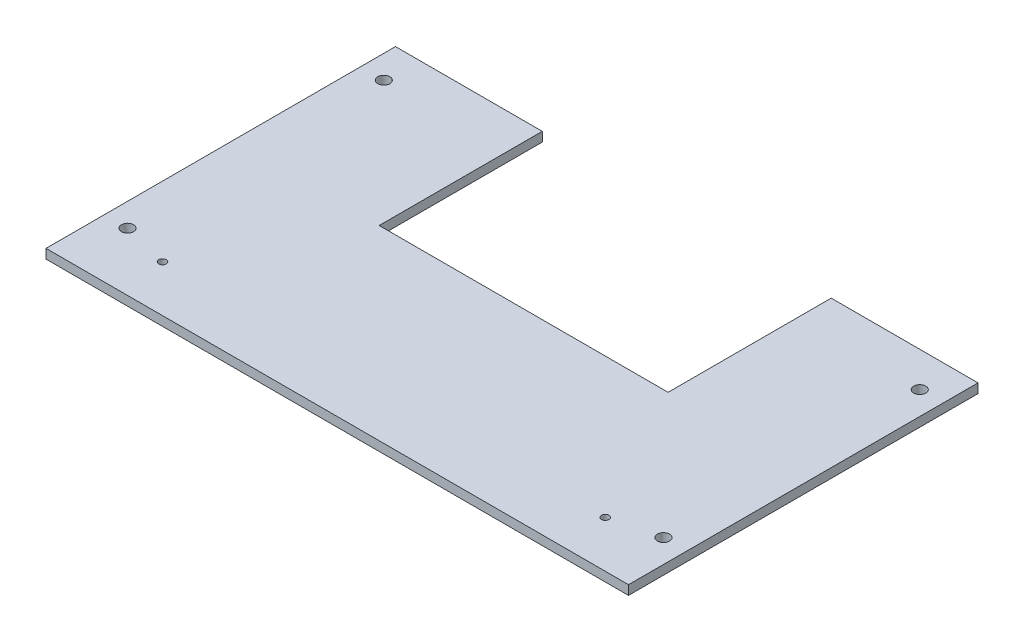
ISO-10303-21;
HEADER;
FILE_DESCRIPTION(('STEP AP214'),'2;1');
FILE_NAME('part.step','',(''),(''),'','','');
FILE_SCHEMA(('AUTOMOTIVE_DESIGN { 1 0 10303 214 1 1 1 1 }'));
ENDSEC;
DATA;
#1=APPLICATION_CONTEXT('core data for automotive mechanical design processes');
#2=APPLICATION_PROTOCOL_DEFINITION('international standard','automotive_design',2000,#1);
#3=PRODUCT_CONTEXT('',#1,'mechanical');
#4=PRODUCT('Part','Part','',(#3));
#5=PRODUCT_RELATED_PRODUCT_CATEGORY('part','',(#4));
#6=PRODUCT_DEFINITION_FORMATION('','',#4);
#7=PRODUCT_DEFINITION_CONTEXT('part definition',#1,'design');
#8=PRODUCT_DEFINITION('design','',#6,#7);
#9=PRODUCT_DEFINITION_SHAPE('','',#8);
#10=(LENGTH_UNIT() NAMED_UNIT(*) SI_UNIT(.MILLI.,.METRE.));
#11=(NAMED_UNIT(*) PLANE_ANGLE_UNIT() SI_UNIT($,.RADIAN.));
#12=(NAMED_UNIT(*) SI_UNIT($,.STERADIAN.) SOLID_ANGLE_UNIT());
#13=UNCERTAINTY_MEASURE_WITH_UNIT(LENGTH_MEASURE(1.E-05),#10,'distance_accuracy_value','');
#14=(GEOMETRIC_REPRESENTATION_CONTEXT(3) GLOBAL_UNCERTAINTY_ASSIGNED_CONTEXT((#13)) GLOBAL_UNIT_ASSIGNED_CONTEXT((#10,
#11,#12)) REPRESENTATION_CONTEXT('',''));
#15=CARTESIAN_POINT('',(0.,0.,0.));
#16=DIRECTION('',(0.,0.,1.));
#17=DIRECTION('',(1.,0.,0.));
#18=AXIS2_PLACEMENT_3D('',#15,#16,#17);
#19=CARTESIAN_POINT('',(-125.,4.,-75.));
#20=DIRECTION('',(0.,0.,1.));
#21=DIRECTION('',(1.,0.,0.));
#22=AXIS2_PLACEMENT_3D('',#19,#20,#21);
#23=PLANE('',#22);
#24=DIRECTION('',(-1.,0.,0.));
#25=VECTOR('',#24,1.);
#26=CARTESIAN_POINT('',(-125.,4.,-75.));
#27=LINE('',#26,#25);
#28=CARTESIAN_POINT('',(-62.,4.,-75.));
#29=VERTEX_POINT('',#28);
#30=CARTESIAN_POINT('',(-125.,4.,-75.));
#31=VERTEX_POINT('',#30);
#32=EDGE_CURVE('E174',#29,#31,#27,.T.);
#33=ORIENTED_EDGE('',*,*,#32,.F.);
#34=DIRECTION('',(0.,1.,0.));
#35=VECTOR('',#34,1.);
#36=CARTESIAN_POINT('',(-62.,0.,-75.));
#37=LINE('',#36,#35);
#38=CARTESIAN_POINT('',(-62.,0.,-75.));
#39=VERTEX_POINT('',#38);
#40=EDGE_CURVE('E162',#39,#29,#37,.T.);
#41=ORIENTED_EDGE('',*,*,#40,.F.);
#42=DIRECTION('',(-1.,0.,0.));
#43=VECTOR('',#42,1.);
#44=CARTESIAN_POINT('',(-125.,0.,-75.));
#45=LINE('',#44,#43);
#46=CARTESIAN_POINT('',(-125.,0.,-75.));
#47=VERTEX_POINT('',#46);
#48=EDGE_CURVE('E144',#39,#47,#45,.T.);
#49=ORIENTED_EDGE('',*,*,#48,.T.);
#50=DIRECTION('',(0.,-1.,0.));
#51=VECTOR('',#50,1.);
#52=CARTESIAN_POINT('',(-125.,4.,-75.));
#53=LINE('',#52,#51);
#54=EDGE_CURVE('E54',#31,#47,#53,.T.);
#55=ORIENTED_EDGE('',*,*,#54,.F.);
#56=EDGE_LOOP('',(#33,#41,#49,#55));
#57=FACE_BOUND('',#56,.T.);
#58=ADVANCED_FACE('F44',(#57),#23,.F.);
#59=CARTESIAN_POINT('',(125.,4.,75.));
#60=DIRECTION('',(-1.,0.,0.));
#61=DIRECTION('',(0.,0.,1.));
#62=AXIS2_PLACEMENT_3D('',#59,#60,#61);
#63=PLANE('',#62);
#64=DIRECTION('',(0.,0.,-1.));
#65=VECTOR('',#64,1.);
#66=CARTESIAN_POINT('',(125.,0.,75.));
#67=LINE('',#66,#65);
#68=CARTESIAN_POINT('',(125.,0.,75.));
#69=VERTEX_POINT('',#68);
#70=CARTESIAN_POINT('',(125.,0.,-75.));
#71=VERTEX_POINT('',#70);
#72=EDGE_CURVE('E165',#69,#71,#67,.T.);
#73=ORIENTED_EDGE('',*,*,#72,.T.);
#74=DIRECTION('',(0.,-1.,0.));
#75=VECTOR('',#74,1.);
#76=CARTESIAN_POINT('',(125.,4.,-75.));
#77=LINE('',#76,#75);
#78=CARTESIAN_POINT('',(125.,4.,-75.));
#79=VERTEX_POINT('',#78);
#80=EDGE_CURVE('E11',#79,#71,#77,.T.);
#81=ORIENTED_EDGE('',*,*,#80,.F.);
#82=DIRECTION('',(0.,0.,-1.));
#83=VECTOR('',#82,1.);
#84=CARTESIAN_POINT('',(125.,4.,75.));
#85=LINE('',#84,#83);
#86=CARTESIAN_POINT('',(125.,4.,75.));
#87=VERTEX_POINT('',#86);
#88=EDGE_CURVE('E171',#87,#79,#85,.T.);
#89=ORIENTED_EDGE('',*,*,#88,.F.);
#90=DIRECTION('',(0.,-1.,0.));
#91=VECTOR('',#90,1.);
#92=CARTESIAN_POINT('',(125.,4.,75.));
#93=LINE('',#92,#91);
#94=EDGE_CURVE('E182',#87,#69,#93,.T.);
#95=ORIENTED_EDGE('',*,*,#94,.T.);
#96=EDGE_LOOP('',(#73,#81,#89,#95));
#97=FACE_BOUND('',#96,.T.);
#98=ADVANCED_FACE('F46',(#97),#63,.F.);
#99=CARTESIAN_POINT('',(62.,0.,-75.));
#100=VERTEX_POINT('',#99);
#101=EDGE_CURVE('E186',#71,#100,#45,.T.);
#102=ORIENTED_EDGE('',*,*,#101,.T.);
#103=DIRECTION('',(0.,1.,0.));
#104=VECTOR('',#103,1.);
#105=CARTESIAN_POINT('',(62.,0.,-75.));
#106=LINE('',#105,#104);
#107=CARTESIAN_POINT('',(62.,4.,-75.));
#108=VERTEX_POINT('',#107);
#109=EDGE_CURVE('E166',#100,#108,#106,.T.);
#110=ORIENTED_EDGE('',*,*,#109,.T.);
#111=EDGE_CURVE('E99',#79,#108,#27,.T.);
#112=ORIENTED_EDGE('',*,*,#111,.F.);
#113=ORIENTED_EDGE('',*,*,#80,.T.);
#114=EDGE_LOOP('',(#102,#110,#112,#113));
#115=FACE_BOUND('',#114,.T.);
#116=ADVANCED_FACE('F271',(#115),#23,.F.);
#117=CARTESIAN_POINT('',(-125.,4.,75.));
#118=DIRECTION('',(1.,0.,0.));
#119=DIRECTION('',(0.,0.,-1.));
#120=AXIS2_PLACEMENT_3D('',#117,#118,#119);
#121=PLANE('',#120);
#122=DIRECTION('',(0.,0.,1.));
#123=VECTOR('',#122,1.);
#124=CARTESIAN_POINT('',(-125.,0.,75.));
#125=LINE('',#124,#123);
#126=CARTESIAN_POINT('',(-125.,0.,75.));
#127=VERTEX_POINT('',#126);
#128=EDGE_CURVE('E190',#47,#127,#125,.T.);
#129=ORIENTED_EDGE('',*,*,#128,.T.);
#130=DIRECTION('',(0.,-1.,0.));
#131=VECTOR('',#130,1.);
#132=CARTESIAN_POINT('',(-125.,4.,75.));
#133=LINE('',#132,#131);
#134=CARTESIAN_POINT('',(-125.,4.,75.));
#135=VERTEX_POINT('',#134);
#136=EDGE_CURVE('E197',#135,#127,#133,.T.);
#137=ORIENTED_EDGE('',*,*,#136,.F.);
#138=DIRECTION('',(0.,0.,1.));
#139=VECTOR('',#138,1.);
#140=CARTESIAN_POINT('',(-125.,4.,75.));
#141=LINE('',#140,#139);
#142=EDGE_CURVE('E177',#31,#135,#141,.T.);
#143=ORIENTED_EDGE('',*,*,#142,.F.);
#144=ORIENTED_EDGE('',*,*,#54,.T.);
#145=EDGE_LOOP('',(#129,#137,#143,#144));
#146=FACE_BOUND('',#145,.T.);
#147=ADVANCED_FACE('F280',(#146),#121,.F.);
#148=CARTESIAN_POINT('',(-125.,4.,75.));
#149=DIRECTION('',(0.,0.,-1.));
#150=DIRECTION('',(-1.,0.,0.));
#151=AXIS2_PLACEMENT_3D('',#148,#149,#150);
#152=PLANE('',#151);
#153=DIRECTION('',(1.,0.,0.));
#154=VECTOR('',#153,1.);
#155=CARTESIAN_POINT('',(-125.,0.,75.));
#156=LINE('',#155,#154);
#157=EDGE_CURVE('E92',#127,#69,#156,.T.);
#158=ORIENTED_EDGE('',*,*,#157,.T.);
#159=ORIENTED_EDGE('',*,*,#94,.F.);
#160=DIRECTION('',(1.,0.,0.));
#161=VECTOR('',#160,1.);
#162=CARTESIAN_POINT('',(-125.,4.,75.));
#163=LINE('',#162,#161);
#164=EDGE_CURVE('E71',#135,#87,#163,.T.);
#165=ORIENTED_EDGE('',*,*,#164,.F.);
#166=ORIENTED_EDGE('',*,*,#136,.T.);
#167=EDGE_LOOP('',(#158,#159,#165,#166));
#168=FACE_BOUND('',#167,.T.);
#169=ADVANCED_FACE('F285',(#168),#152,.F.);
#170=CARTESIAN_POINT('',(0.,4.,0.));
#171=DIRECTION('',(0.,-1.,0.));
#172=DIRECTION('',(0.,0.,-1.));
#173=AXIS2_PLACEMENT_3D('',#170,#171,#172);
#174=PLANE('',#173);
#175=CARTESIAN_POINT('',(95.,4.,55.));
#176=DIRECTION('',(0.,1.,0.));
#177=DIRECTION('',(0.,0.,1.));
#178=AXIS2_PLACEMENT_3D('',#175,#176,#177);
#179=CIRCLE('',#178,1.60000000000001);
#180=CARTESIAN_POINT('',(95.,4.,56.6));
#181=VERTEX_POINT('',#180);
#182=EDGE_CURVE('E205',#181,#181,#179,.T.);
#183=ORIENTED_EDGE('',*,*,#182,.F.);
#184=EDGE_LOOP('',(#183));
#185=FACE_BOUND('',#184,.T.);
#186=CARTESIAN_POINT('',(-95.,4.,55.0000000000013));
#187=DIRECTION('',(0.,1.,0.));
#188=DIRECTION('',(0.,0.,1.));
#189=AXIS2_PLACEMENT_3D('',#186,#187,#188);
#190=CIRCLE('',#189,1.60000000000001);
#191=CARTESIAN_POINT('',(-95.,4.,56.6000000000013));
#192=VERTEX_POINT('',#191);
#193=EDGE_CURVE('E212',#192,#192,#190,.T.);
#194=ORIENTED_EDGE('',*,*,#193,.F.);
#195=EDGE_LOOP('',(#194));
#196=FACE_BOUND('',#195,.T.);
#197=CARTESIAN_POINT('',(-114.999999999999,4.,50.));
#198=DIRECTION('',(0.,1.,0.));
#199=DIRECTION('',(0.,0.,1.));
#200=AXIS2_PLACEMENT_3D('',#197,#198,#199);
#201=CIRCLE('',#200,2.6);
#202=CARTESIAN_POINT('',(-114.999999999999,4.,52.6));
#203=VERTEX_POINT('',#202);
#204=EDGE_CURVE('E242',#203,#203,#201,.T.);
#205=ORIENTED_EDGE('',*,*,#204,.F.);
#206=EDGE_LOOP('',(#205));
#207=FACE_BOUND('',#206,.T.);
#208=CARTESIAN_POINT('',(115.000000000001,4.,50.));
#209=DIRECTION('',(0.,1.,0.));
#210=DIRECTION('',(0.,0.,1.));
#211=AXIS2_PLACEMENT_3D('',#208,#209,#210);
#212=CIRCLE('',#211,2.6);
#213=CARTESIAN_POINT('',(115.000000000001,4.,52.6));
#214=VERTEX_POINT('',#213);
#215=EDGE_CURVE('E235',#214,#214,#212,.T.);
#216=ORIENTED_EDGE('',*,*,#215,.F.);
#217=EDGE_LOOP('',(#216));
#218=FACE_BOUND('',#217,.T.);
#219=CARTESIAN_POINT('',(115.,4.,-60.));
#220=DIRECTION('',(0.,1.,0.));
#221=DIRECTION('',(0.,0.,1.));
#222=AXIS2_PLACEMENT_3D('',#219,#220,#221);
#223=CIRCLE('',#222,2.6);
#224=CARTESIAN_POINT('',(115.,4.,-57.4));
#225=VERTEX_POINT('',#224);
#226=EDGE_CURVE('E227',#225,#225,#223,.T.);
#227=ORIENTED_EDGE('',*,*,#226,.F.);
#228=EDGE_LOOP('',(#227));
#229=FACE_BOUND('',#228,.T.);
#230=CARTESIAN_POINT('',(-115.,4.,-60.));
#231=DIRECTION('',(0.,1.,0.));
#232=DIRECTION('',(0.,0.,1.));
#233=AXIS2_PLACEMENT_3D('',#230,#231,#232);
#234=CIRCLE('',#233,2.6);
#235=CARTESIAN_POINT('',(-115.,4.,-57.4));
#236=VERTEX_POINT('',#235);
#237=EDGE_CURVE('E159',#236,#236,#234,.T.);
#238=ORIENTED_EDGE('',*,*,#237,.F.);
#239=EDGE_LOOP('',(#238));
#240=FACE_BOUND('',#239,.T.);
#241=DIRECTION('',(1.,0.,0.));
#242=VECTOR('',#241,1.);
#243=CARTESIAN_POINT('',(-62.,4.,-4.99999999999999));
#244=LINE('',#243,#242);
#245=CARTESIAN_POINT('',(-62.,4.,-4.99999999999999));
#246=VERTEX_POINT('',#245);
#247=CARTESIAN_POINT('',(62.,4.,-4.99999999999999));
#248=VERTEX_POINT('',#247);
#249=EDGE_CURVE('E149',#246,#248,#244,.T.);
#250=ORIENTED_EDGE('',*,*,#249,.F.);
#251=DIRECTION('',(0.,0.,1.));
#252=VECTOR('',#251,1.);
#253=CARTESIAN_POINT('',(-62.,4.,-4.99999999999999));
#254=LINE('',#253,#252);
#255=EDGE_CURVE('E128',#29,#246,#254,.T.);
#256=ORIENTED_EDGE('',*,*,#255,.F.);
#257=ORIENTED_EDGE('',*,*,#32,.T.);
#258=ORIENTED_EDGE('',*,*,#142,.T.);
#259=ORIENTED_EDGE('',*,*,#164,.T.);
#260=ORIENTED_EDGE('',*,*,#88,.T.);
#261=ORIENTED_EDGE('',*,*,#111,.T.);
#262=DIRECTION('',(0.,0.,-1.));
#263=VECTOR('',#262,1.);
#264=CARTESIAN_POINT('',(62.,4.,-4.99999999999999));
#265=LINE('',#264,#263);
#266=EDGE_CURVE('E146',#248,#108,#265,.T.);
#267=ORIENTED_EDGE('',*,*,#266,.F.);
#268=EDGE_LOOP('',(#250,#256,#257,#258,#259,#260,#261,#267));
#269=FACE_BOUND('',#268,.T.);
#270=ADVANCED_FACE('F295',(#185,#196,#207,#218,#229,#240,#269),#174,.F.);
#271=CARTESIAN_POINT('',(0.,0.,0.));
#272=DIRECTION('',(0.,-1.,0.));
#273=DIRECTION('',(0.,0.,-1.));
#274=AXIS2_PLACEMENT_3D('',#271,#272,#273);
#275=PLANE('',#274);
#276=CARTESIAN_POINT('',(95.,0.,55.));
#277=DIRECTION('',(0.,-1.,0.));
#278=DIRECTION('',(0.,0.,-1.));
#279=AXIS2_PLACEMENT_3D('',#276,#277,#278);
#280=CIRCLE('',#279,1.60000000000001);
#281=CARTESIAN_POINT('',(95.,0.,53.4));
#282=VERTEX_POINT('',#281);
#283=EDGE_CURVE('E48',#282,#282,#280,.T.);
#284=ORIENTED_EDGE('',*,*,#283,.F.);
#285=EDGE_LOOP('',(#284));
#286=FACE_BOUND('',#285,.T.);
#287=CARTESIAN_POINT('',(-95.,0.,55.0000000000013));
#288=DIRECTION('',(0.,-1.,0.));
#289=DIRECTION('',(0.,0.,-1.));
#290=AXIS2_PLACEMENT_3D('',#287,#288,#289);
#291=CIRCLE('',#290,1.60000000000001);
#292=CARTESIAN_POINT('',(-95.,0.,53.4000000000013));
#293=VERTEX_POINT('',#292);
#294=EDGE_CURVE('E202',#293,#293,#291,.T.);
#295=ORIENTED_EDGE('',*,*,#294,.F.);
#296=EDGE_LOOP('',(#295));
#297=FACE_BOUND('',#296,.T.);
#298=CARTESIAN_POINT('',(-114.999999999999,0.,50.));
#299=DIRECTION('',(0.,1.,0.));
#300=DIRECTION('',(0.,0.,1.));
#301=AXIS2_PLACEMENT_3D('',#298,#299,#300);
#302=CIRCLE('',#301,2.6);
#303=CARTESIAN_POINT('',(-114.999999999999,0.,52.6));
#304=VERTEX_POINT('',#303);
#305=EDGE_CURVE('E152',#304,#304,#302,.T.);
#306=ORIENTED_EDGE('',*,*,#305,.T.);
#307=EDGE_LOOP('',(#306));
#308=FACE_BOUND('',#307,.T.);
#309=CARTESIAN_POINT('',(115.000000000001,0.,50.));
#310=DIRECTION('',(0.,1.,0.));
#311=DIRECTION('',(0.,0.,1.));
#312=AXIS2_PLACEMENT_3D('',#309,#310,#311);
#313=CIRCLE('',#312,2.6);
#314=CARTESIAN_POINT('',(115.000000000001,0.,52.6));
#315=VERTEX_POINT('',#314);
#316=EDGE_CURVE('E239',#315,#315,#313,.T.);
#317=ORIENTED_EDGE('',*,*,#316,.T.);
#318=EDGE_LOOP('',(#317));
#319=FACE_BOUND('',#318,.T.);
#320=CARTESIAN_POINT('',(115.,0.,-60.));
#321=DIRECTION('',(0.,1.,0.));
#322=DIRECTION('',(0.,0.,1.));
#323=AXIS2_PLACEMENT_3D('',#320,#321,#322);
#324=CIRCLE('',#323,2.6);
#325=CARTESIAN_POINT('',(115.,0.,-57.4));
#326=VERTEX_POINT('',#325);
#327=EDGE_CURVE('E231',#326,#326,#324,.T.);
#328=ORIENTED_EDGE('',*,*,#327,.T.);
#329=EDGE_LOOP('',(#328));
#330=FACE_BOUND('',#329,.T.);
#331=CARTESIAN_POINT('',(-115.,0.,-60.));
#332=DIRECTION('',(0.,1.,0.));
#333=DIRECTION('',(0.,0.,1.));
#334=AXIS2_PLACEMENT_3D('',#331,#332,#333);
#335=CIRCLE('',#334,2.6);
#336=CARTESIAN_POINT('',(-115.,0.,-57.4));
#337=VERTEX_POINT('',#336);
#338=EDGE_CURVE('E223',#337,#337,#335,.T.);
#339=ORIENTED_EDGE('',*,*,#338,.T.);
#340=EDGE_LOOP('',(#339));
#341=FACE_BOUND('',#340,.T.);
#342=DIRECTION('',(0.,0.,1.));
#343=VECTOR('',#342,1.);
#344=CARTESIAN_POINT('',(-62.,0.,-4.99999999999999));
#345=LINE('',#344,#343);
#346=CARTESIAN_POINT('',(-62.,0.,-4.99999999999999));
#347=VERTEX_POINT('',#346);
#348=EDGE_CURVE('E125',#39,#347,#345,.T.);
#349=ORIENTED_EDGE('',*,*,#348,.T.);
#350=DIRECTION('',(1.,0.,0.));
#351=VECTOR('',#350,1.);
#352=CARTESIAN_POINT('',(-62.,0.,-4.99999999999999));
#353=LINE('',#352,#351);
#354=CARTESIAN_POINT('',(62.,0.,-4.99999999999999));
#355=VERTEX_POINT('',#354);
#356=EDGE_CURVE('E136',#347,#355,#353,.T.);
#357=ORIENTED_EDGE('',*,*,#356,.T.);
#358=DIRECTION('',(0.,0.,-1.));
#359=VECTOR('',#358,1.);
#360=CARTESIAN_POINT('',(62.,0.,-4.99999999999999));
#361=LINE('',#360,#359);
#362=EDGE_CURVE('E62',#355,#100,#361,.T.);
#363=ORIENTED_EDGE('',*,*,#362,.T.);
#364=ORIENTED_EDGE('',*,*,#101,.F.);
#365=ORIENTED_EDGE('',*,*,#72,.F.);
#366=ORIENTED_EDGE('',*,*,#157,.F.);
#367=ORIENTED_EDGE('',*,*,#128,.F.);
#368=ORIENTED_EDGE('',*,*,#48,.F.);
#369=EDGE_LOOP('',(#349,#357,#363,#364,#365,#366,#367,#368));
#370=FACE_BOUND('',#369,.T.);
#371=ADVANCED_FACE('F142',(#286,#297,#308,#319,#330,#341,#370),#275,.T.);
#372=CARTESIAN_POINT('',(-62.,0.,-4.99999999999999));
#373=DIRECTION('',(-1.,0.,0.));
#374=DIRECTION('',(0.,0.,1.));
#375=AXIS2_PLACEMENT_3D('',#372,#373,#374);
#376=PLANE('',#375);
#377=ORIENTED_EDGE('',*,*,#255,.T.);
#378=DIRECTION('',(0.,1.,0.));
#379=VECTOR('',#378,1.);
#380=CARTESIAN_POINT('',(-62.,0.,-4.99999999999999));
#381=LINE('',#380,#379);
#382=EDGE_CURVE('E121',#347,#246,#381,.T.);
#383=ORIENTED_EDGE('',*,*,#382,.F.);
#384=ORIENTED_EDGE('',*,*,#348,.F.);
#385=ORIENTED_EDGE('',*,*,#40,.T.);
#386=EDGE_LOOP('',(#377,#383,#384,#385));
#387=FACE_BOUND('',#386,.T.);
#388=ADVANCED_FACE('F123',(#387),#376,.F.);
#389=CARTESIAN_POINT('',(62.,0.,-4.99999999999999));
#390=DIRECTION('',(1.,0.,0.));
#391=DIRECTION('',(0.,0.,-1.));
#392=AXIS2_PLACEMENT_3D('',#389,#390,#391);
#393=PLANE('',#392);
#394=ORIENTED_EDGE('',*,*,#266,.T.);
#395=ORIENTED_EDGE('',*,*,#109,.F.);
#396=ORIENTED_EDGE('',*,*,#362,.F.);
#397=DIRECTION('',(0.,1.,0.));
#398=VECTOR('',#397,1.);
#399=CARTESIAN_POINT('',(62.,0.,-4.99999999999999));
#400=LINE('',#399,#398);
#401=EDGE_CURVE('E133',#355,#248,#400,.T.);
#402=ORIENTED_EDGE('',*,*,#401,.T.);
#403=EDGE_LOOP('',(#394,#395,#396,#402));
#404=FACE_BOUND('',#403,.T.);
#405=ADVANCED_FACE('F297',(#404),#393,.F.);
#406=CARTESIAN_POINT('',(-62.,0.,-4.99999999999999));
#407=DIRECTION('',(0.,0.,1.));
#408=DIRECTION('',(1.,0.,0.));
#409=AXIS2_PLACEMENT_3D('',#406,#407,#408);
#410=PLANE('',#409);
#411=ORIENTED_EDGE('',*,*,#249,.T.);
#412=ORIENTED_EDGE('',*,*,#401,.F.);
#413=ORIENTED_EDGE('',*,*,#356,.F.);
#414=ORIENTED_EDGE('',*,*,#382,.T.);
#415=EDGE_LOOP('',(#411,#412,#413,#414));
#416=FACE_BOUND('',#415,.T.);
#417=ADVANCED_FACE('F137',(#416),#410,.F.);
#418=CARTESIAN_POINT('',(-115.,0.,-60.));
#419=DIRECTION('',(0.,1.,0.));
#420=DIRECTION('',(0.,0.,1.));
#421=AXIS2_PLACEMENT_3D('',#418,#419,#420);
#422=CYLINDRICAL_SURFACE('',#421,2.6);
#423=ORIENTED_EDGE('',*,*,#338,.F.);
#424=EDGE_LOOP('',(#423));
#425=FACE_BOUND('',#424,.T.);
#426=ORIENTED_EDGE('',*,*,#237,.T.);
#427=EDGE_LOOP('',(#426));
#428=FACE_BOUND('',#427,.T.);
#429=ADVANCED_FACE('F302',(#425,#428),#422,.F.);
#430=CARTESIAN_POINT('',(115.,0.,-60.));
#431=DIRECTION('',(0.,1.,0.));
#432=DIRECTION('',(0.,0.,1.));
#433=AXIS2_PLACEMENT_3D('',#430,#431,#432);
#434=CYLINDRICAL_SURFACE('',#433,2.6);
#435=ORIENTED_EDGE('',*,*,#327,.F.);
#436=EDGE_LOOP('',(#435));
#437=FACE_BOUND('',#436,.T.);
#438=ORIENTED_EDGE('',*,*,#226,.T.);
#439=EDGE_LOOP('',(#438));
#440=FACE_BOUND('',#439,.T.);
#441=ADVANCED_FACE('F265',(#437,#440),#434,.F.);
#442=CARTESIAN_POINT('',(115.000000000001,0.,50.));
#443=DIRECTION('',(0.,1.,0.));
#444=DIRECTION('',(0.,0.,1.));
#445=AXIS2_PLACEMENT_3D('',#442,#443,#444);
#446=CYLINDRICAL_SURFACE('',#445,2.6);
#447=ORIENTED_EDGE('',*,*,#316,.F.);
#448=EDGE_LOOP('',(#447));
#449=FACE_BOUND('',#448,.T.);
#450=ORIENTED_EDGE('',*,*,#215,.T.);
#451=EDGE_LOOP('',(#450));
#452=FACE_BOUND('',#451,.T.);
#453=ADVANCED_FACE('F256',(#449,#452),#446,.F.);
#454=CARTESIAN_POINT('',(-114.999999999999,0.,50.));
#455=DIRECTION('',(0.,1.,0.));
#456=DIRECTION('',(0.,0.,1.));
#457=AXIS2_PLACEMENT_3D('',#454,#455,#456);
#458=CYLINDRICAL_SURFACE('',#457,2.6);
#459=ORIENTED_EDGE('',*,*,#305,.F.);
#460=EDGE_LOOP('',(#459));
#461=FACE_BOUND('',#460,.T.);
#462=ORIENTED_EDGE('',*,*,#204,.T.);
#463=EDGE_LOOP('',(#462));
#464=FACE_BOUND('',#463,.T.);
#465=ADVANCED_FACE('F253',(#461,#464),#458,.F.);
#466=CARTESIAN_POINT('',(-95.,-6.,55.0000000000013));
#467=DIRECTION('',(0.,1.,0.));
#468=DIRECTION('',(0.,0.,1.));
#469=AXIS2_PLACEMENT_3D('',#466,#467,#468);
#470=CYLINDRICAL_SURFACE('',#469,1.60000000000001);
#471=ORIENTED_EDGE('',*,*,#294,.T.);
#472=EDGE_LOOP('',(#471));
#473=FACE_BOUND('',#472,.T.);
#474=ORIENTED_EDGE('',*,*,#193,.T.);
#475=EDGE_LOOP('',(#474));
#476=FACE_BOUND('',#475,.T.);
#477=ADVANCED_FACE('F255',(#473,#476),#470,.F.);
#478=CARTESIAN_POINT('',(95.,-6.,55.));
#479=DIRECTION('',(0.,1.,0.));
#480=DIRECTION('',(0.,0.,1.));
#481=AXIS2_PLACEMENT_3D('',#478,#479,#480);
#482=CYLINDRICAL_SURFACE('',#481,1.60000000000001);
#483=ORIENTED_EDGE('',*,*,#283,.T.);
#484=EDGE_LOOP('',(#483));
#485=FACE_BOUND('',#484,.T.);
#486=ORIENTED_EDGE('',*,*,#182,.T.);
#487=EDGE_LOOP('',(#486));
#488=FACE_BOUND('',#487,.T.);
#489=ADVANCED_FACE('F263',(#485,#488),#482,.F.);
#490=CLOSED_SHELL('',(#58,#98,#116,#147,#169,#270,#371,#388,#405,#417,#429,#441,#453,#465,#477,#489));
#491=MANIFOLD_SOLID_BREP('B2',#490);
#492=ADVANCED_BREP_SHAPE_REPRESENTATION('',(#18,#491),#14);
#493=SHAPE_DEFINITION_REPRESENTATION(#9,#492);
ENDSEC;
END-ISO-10303-21;
